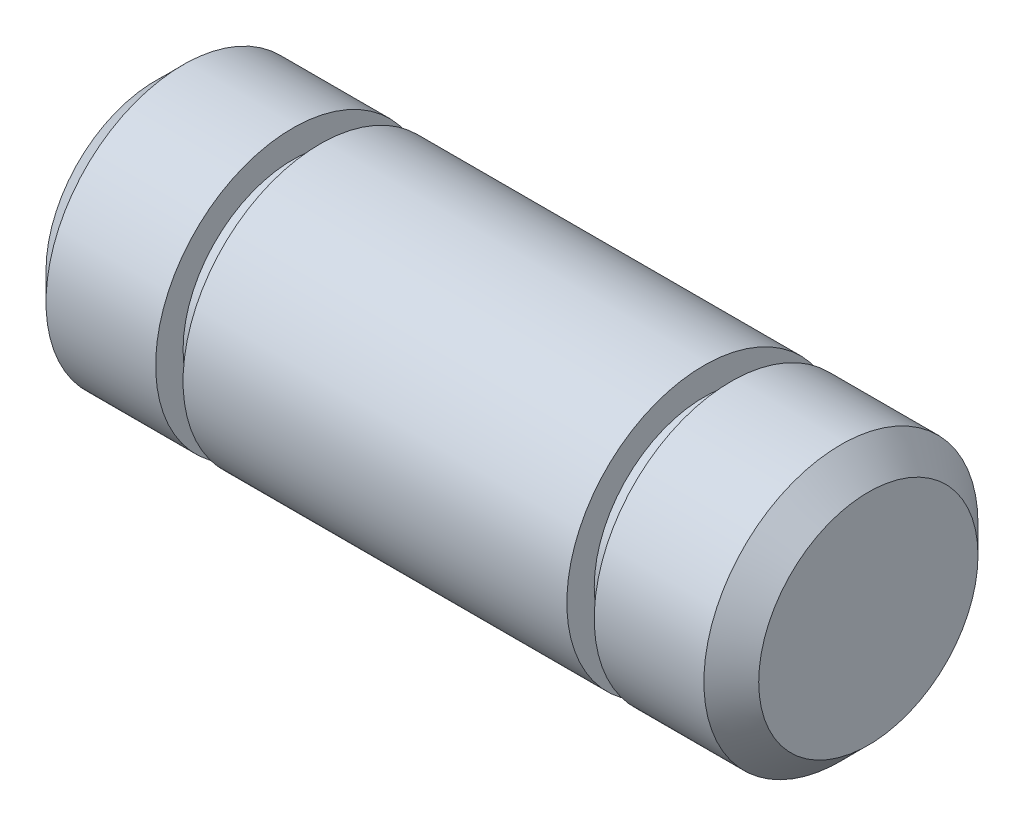
ISO-10303-21;
HEADER;
FILE_DESCRIPTION(('STEP AP214'),'2;1');
FILE_NAME('part.step','',(''),(''),'','','');
FILE_SCHEMA(('AUTOMOTIVE_DESIGN { 1 0 10303 214 1 1 1 1 }'));
ENDSEC;
DATA;
#1=APPLICATION_CONTEXT('core data for automotive mechanical design processes');
#2=APPLICATION_PROTOCOL_DEFINITION('international standard','automotive_design',2000,#1);
#3=PRODUCT_CONTEXT('',#1,'mechanical');
#4=PRODUCT('Part','Part','',(#3));
#5=PRODUCT_RELATED_PRODUCT_CATEGORY('part','',(#4));
#6=PRODUCT_DEFINITION_FORMATION('','',#4);
#7=PRODUCT_DEFINITION_CONTEXT('part definition',#1,'design');
#8=PRODUCT_DEFINITION('design','',#6,#7);
#9=PRODUCT_DEFINITION_SHAPE('','',#8);
#10=(LENGTH_UNIT() NAMED_UNIT(*) SI_UNIT(.MILLI.,.METRE.));
#11=(NAMED_UNIT(*) PLANE_ANGLE_UNIT() SI_UNIT($,.RADIAN.));
#12=(NAMED_UNIT(*) SI_UNIT($,.STERADIAN.) SOLID_ANGLE_UNIT());
#13=UNCERTAINTY_MEASURE_WITH_UNIT(LENGTH_MEASURE(1.E-05),#10,'distance_accuracy_value','');
#14=(GEOMETRIC_REPRESENTATION_CONTEXT(3) GLOBAL_UNCERTAINTY_ASSIGNED_CONTEXT((#13)) GLOBAL_UNIT_ASSIGNED_CONTEXT((#10,
#11,#12)) REPRESENTATION_CONTEXT('',''));
#15=CARTESIAN_POINT('',(0.,0.,0.));
#16=DIRECTION('',(0.,0.,1.));
#17=DIRECTION('',(1.,0.,0.));
#18=AXIS2_PLACEMENT_3D('',#15,#16,#17);
#19=CARTESIAN_POINT('',(0.,0.,0.));
#20=DIRECTION('',(-1.,0.,0.));
#21=DIRECTION('',(0.,0.,1.));
#22=AXIS2_PLACEMENT_3D('',#19,#20,#21);
#23=PLANE('',#22);
#24=CARTESIAN_POINT('',(0.,0.,0.));
#25=DIRECTION('',(1.,0.,0.));
#26=DIRECTION('',(0.,0.,-1.));
#27=AXIS2_PLACEMENT_3D('',#24,#25,#26);
#28=CIRCLE('',#27,4.);
#29=CARTESIAN_POINT('',(0.,0.,-4.));
#30=VERTEX_POINT('',#29);
#31=EDGE_CURVE('E10',#30,#30,#28,.T.);
#32=ORIENTED_EDGE('',*,*,#31,.F.);
#33=EDGE_LOOP('',(#32));
#34=FACE_BOUND('',#33,.T.);
#35=ADVANCED_FACE('F37',(#34),#23,.T.);
#36=CARTESIAN_POINT('',(1.,0.,0.));
#37=DIRECTION('',(1.,0.,0.));
#38=DIRECTION('',(0.,0.,-1.));
#39=AXIS2_PLACEMENT_3D('',#36,#37,#38);
#40=CONICAL_SURFACE('',#39,5.,0.785398163397448);
#41=ORIENTED_EDGE('',*,*,#31,.T.);
#42=EDGE_LOOP('',(#41));
#43=FACE_BOUND('',#42,.T.);
#44=CARTESIAN_POINT('',(1.,0.,0.));
#45=DIRECTION('',(1.,0.,0.));
#46=DIRECTION('',(0.,0.,-1.));
#47=AXIS2_PLACEMENT_3D('',#44,#45,#46);
#48=CIRCLE('',#47,5.);
#49=CARTESIAN_POINT('',(1.,0.,-5.));
#50=VERTEX_POINT('',#49);
#51=EDGE_CURVE('E44',#50,#50,#48,.T.);
#52=ORIENTED_EDGE('',*,*,#51,.F.);
#53=EDGE_LOOP('',(#52));
#54=FACE_BOUND('',#53,.T.);
#55=ADVANCED_FACE('F109',(#43,#54),#40,.T.);
#56=CARTESIAN_POINT('',(26.,0.,0.));
#57=DIRECTION('',(1.,0.,0.));
#58=DIRECTION('',(0.,0.,-1.));
#59=AXIS2_PLACEMENT_3D('',#56,#57,#58);
#60=CYLINDRICAL_SURFACE('',#59,5.);
#61=ORIENTED_EDGE('',*,*,#51,.T.);
#62=EDGE_LOOP('',(#61));
#63=FACE_BOUND('',#62,.T.);
#64=CARTESIAN_POINT('',(5.,0.,0.));
#65=DIRECTION('',(1.,0.,0.));
#66=DIRECTION('',(0.,0.,-1.));
#67=AXIS2_PLACEMENT_3D('',#64,#65,#66);
#68=CIRCLE('',#67,5.);
#69=CARTESIAN_POINT('',(5.,0.,-5.));
#70=VERTEX_POINT('',#69);
#71=EDGE_CURVE('E49',#70,#70,#68,.T.);
#72=ORIENTED_EDGE('',*,*,#71,.F.);
#73=EDGE_LOOP('',(#72));
#74=FACE_BOUND('',#73,.T.);
#75=ADVANCED_FACE('F114',(#63,#74),#60,.T.);
#76=CARTESIAN_POINT('',(5.,0.,-5.));
#77=DIRECTION('',(1.,0.,0.));
#78=DIRECTION('',(0.,0.,-1.));
#79=AXIS2_PLACEMENT_3D('',#76,#77,#78);
#80=PLANE('',#79);
#81=ORIENTED_EDGE('',*,*,#71,.T.);
#82=EDGE_LOOP('',(#81));
#83=FACE_BOUND('',#82,.T.);
#84=CARTESIAN_POINT('',(5.,0.,0.));
#85=DIRECTION('',(1.,0.,0.));
#86=DIRECTION('',(0.,0.,-1.));
#87=AXIS2_PLACEMENT_3D('',#84,#85,#86);
#88=CIRCLE('',#87,4.);
#89=CARTESIAN_POINT('',(5.,0.,-4.));
#90=VERTEX_POINT('',#89);
#91=EDGE_CURVE('E54',#90,#90,#88,.T.);
#92=ORIENTED_EDGE('',*,*,#91,.F.);
#93=EDGE_LOOP('',(#92));
#94=FACE_BOUND('',#93,.T.);
#95=ADVANCED_FACE('F118',(#83,#94),#80,.T.);
#96=CARTESIAN_POINT('',(26.,0.,0.));
#97=DIRECTION('',(1.,0.,0.));
#98=DIRECTION('',(0.,0.,-1.));
#99=AXIS2_PLACEMENT_3D('',#96,#97,#98);
#100=CYLINDRICAL_SURFACE('',#99,4.);
#101=ORIENTED_EDGE('',*,*,#91,.T.);
#102=EDGE_LOOP('',(#101));
#103=FACE_BOUND('',#102,.T.);
#104=CARTESIAN_POINT('',(6.,0.,0.));
#105=DIRECTION('',(1.,0.,0.));
#106=DIRECTION('',(0.,0.,-1.));
#107=AXIS2_PLACEMENT_3D('',#104,#105,#106);
#108=CIRCLE('',#107,4.);
#109=CARTESIAN_POINT('',(6.,0.,-4.));
#110=VERTEX_POINT('',#109);
#111=EDGE_CURVE('E60',#110,#110,#108,.T.);
#112=ORIENTED_EDGE('',*,*,#111,.F.);
#113=EDGE_LOOP('',(#112));
#114=FACE_BOUND('',#113,.T.);
#115=ADVANCED_FACE('F124',(#103,#114),#100,.T.);
#116=CARTESIAN_POINT('',(6.,0.,-4.));
#117=DIRECTION('',(-1.,0.,0.));
#118=DIRECTION('',(0.,0.,1.));
#119=AXIS2_PLACEMENT_3D('',#116,#117,#118);
#120=PLANE('',#119);
#121=ORIENTED_EDGE('',*,*,#111,.T.);
#122=EDGE_LOOP('',(#121));
#123=FACE_BOUND('',#122,.T.);
#124=CARTESIAN_POINT('',(6.,0.,0.));
#125=DIRECTION('',(1.,0.,0.));
#126=DIRECTION('',(0.,0.,-1.));
#127=AXIS2_PLACEMENT_3D('',#124,#125,#126);
#128=CIRCLE('',#127,5.);
#129=CARTESIAN_POINT('',(6.,0.,-5.));
#130=VERTEX_POINT('',#129);
#131=EDGE_CURVE('E64',#130,#130,#128,.T.);
#132=ORIENTED_EDGE('',*,*,#131,.F.);
#133=EDGE_LOOP('',(#132));
#134=FACE_BOUND('',#133,.T.);
#135=ADVANCED_FACE('F128',(#123,#134),#120,.T.);
#136=CARTESIAN_POINT('',(26.,0.,0.));
#137=DIRECTION('',(1.,0.,0.));
#138=DIRECTION('',(0.,0.,-1.));
#139=AXIS2_PLACEMENT_3D('',#136,#137,#138);
#140=CYLINDRICAL_SURFACE('',#139,5.);
#141=ORIENTED_EDGE('',*,*,#131,.T.);
#142=EDGE_LOOP('',(#141));
#143=FACE_BOUND('',#142,.T.);
#144=CARTESIAN_POINT('',(20.,0.,0.));
#145=DIRECTION('',(1.,0.,0.));
#146=DIRECTION('',(0.,0.,-1.));
#147=AXIS2_PLACEMENT_3D('',#144,#145,#146);
#148=CIRCLE('',#147,5.);
#149=CARTESIAN_POINT('',(20.,0.,-5.));
#150=VERTEX_POINT('',#149);
#151=EDGE_CURVE('E68',#150,#150,#148,.T.);
#152=ORIENTED_EDGE('',*,*,#151,.F.);
#153=EDGE_LOOP('',(#152));
#154=FACE_BOUND('',#153,.T.);
#155=ADVANCED_FACE('F132',(#143,#154),#140,.T.);
#156=CARTESIAN_POINT('',(20.,0.,-5.));
#157=DIRECTION('',(1.,0.,0.));
#158=DIRECTION('',(0.,0.,-1.));
#159=AXIS2_PLACEMENT_3D('',#156,#157,#158);
#160=PLANE('',#159);
#161=ORIENTED_EDGE('',*,*,#151,.T.);
#162=EDGE_LOOP('',(#161));
#163=FACE_BOUND('',#162,.T.);
#164=CARTESIAN_POINT('',(20.,0.,0.));
#165=DIRECTION('',(1.,0.,0.));
#166=DIRECTION('',(0.,0.,-1.));
#167=AXIS2_PLACEMENT_3D('',#164,#165,#166);
#168=CIRCLE('',#167,4.);
#169=CARTESIAN_POINT('',(20.,0.,-4.));
#170=VERTEX_POINT('',#169);
#171=EDGE_CURVE('E72',#170,#170,#168,.T.);
#172=ORIENTED_EDGE('',*,*,#171,.F.);
#173=EDGE_LOOP('',(#172));
#174=FACE_BOUND('',#173,.T.);
#175=ADVANCED_FACE('F136',(#163,#174),#160,.T.);
#176=CARTESIAN_POINT('',(26.,0.,0.));
#177=DIRECTION('',(1.,0.,0.));
#178=DIRECTION('',(0.,0.,-1.));
#179=AXIS2_PLACEMENT_3D('',#176,#177,#178);
#180=CYLINDRICAL_SURFACE('',#179,4.);
#181=ORIENTED_EDGE('',*,*,#171,.T.);
#182=EDGE_LOOP('',(#181));
#183=FACE_BOUND('',#182,.T.);
#184=CARTESIAN_POINT('',(21.,0.,0.));
#185=DIRECTION('',(1.,0.,0.));
#186=DIRECTION('',(0.,0.,-1.));
#187=AXIS2_PLACEMENT_3D('',#184,#185,#186);
#188=CIRCLE('',#187,4.);
#189=CARTESIAN_POINT('',(21.,0.,-4.));
#190=VERTEX_POINT('',#189);
#191=EDGE_CURVE('E76',#190,#190,#188,.T.);
#192=ORIENTED_EDGE('',*,*,#191,.F.);
#193=EDGE_LOOP('',(#192));
#194=FACE_BOUND('',#193,.T.);
#195=ADVANCED_FACE('F140',(#183,#194),#180,.T.);
#196=CARTESIAN_POINT('',(21.,0.,-4.));
#197=DIRECTION('',(-1.,0.,0.));
#198=DIRECTION('',(0.,0.,1.));
#199=AXIS2_PLACEMENT_3D('',#196,#197,#198);
#200=PLANE('',#199);
#201=ORIENTED_EDGE('',*,*,#191,.T.);
#202=EDGE_LOOP('',(#201));
#203=FACE_BOUND('',#202,.T.);
#204=CARTESIAN_POINT('',(21.,0.,0.));
#205=DIRECTION('',(1.,0.,0.));
#206=DIRECTION('',(0.,0.,-1.));
#207=AXIS2_PLACEMENT_3D('',#204,#205,#206);
#208=CIRCLE('',#207,5.);
#209=CARTESIAN_POINT('',(21.,0.,-5.));
#210=VERTEX_POINT('',#209);
#211=EDGE_CURVE('E80',#210,#210,#208,.T.);
#212=ORIENTED_EDGE('',*,*,#211,.F.);
#213=EDGE_LOOP('',(#212));
#214=FACE_BOUND('',#213,.T.);
#215=ADVANCED_FACE('F105',(#203,#214),#200,.T.);
#216=CARTESIAN_POINT('',(26.,0.,0.));
#217=DIRECTION('',(1.,0.,0.));
#218=DIRECTION('',(0.,0.,-1.));
#219=AXIS2_PLACEMENT_3D('',#216,#217,#218);
#220=CYLINDRICAL_SURFACE('',#219,5.);
#221=ORIENTED_EDGE('',*,*,#211,.T.);
#222=EDGE_LOOP('',(#221));
#223=FACE_BOUND('',#222,.T.);
#224=CARTESIAN_POINT('',(25.,0.,0.));
#225=DIRECTION('',(1.,0.,0.));
#226=DIRECTION('',(0.,0.,-1.));
#227=AXIS2_PLACEMENT_3D('',#224,#225,#226);
#228=CIRCLE('',#227,5.);
#229=CARTESIAN_POINT('',(25.,0.,-5.));
#230=VERTEX_POINT('',#229);
#231=EDGE_CURVE('E84',#230,#230,#228,.T.);
#232=ORIENTED_EDGE('',*,*,#231,.F.);
#233=EDGE_LOOP('',(#232));
#234=FACE_BOUND('',#233,.T.);
#235=ADVANCED_FACE('F97',(#223,#234),#220,.T.);
#236=CARTESIAN_POINT('',(26.,0.,0.));
#237=DIRECTION('',(-1.,0.,0.));
#238=DIRECTION('',(0.,0.,1.));
#239=AXIS2_PLACEMENT_3D('',#236,#237,#238);
#240=CONICAL_SURFACE('',#239,4.,0.785398163397448);
#241=ORIENTED_EDGE('',*,*,#231,.T.);
#242=EDGE_LOOP('',(#241));
#243=FACE_BOUND('',#242,.T.);
#244=CARTESIAN_POINT('',(26.,0.,0.));
#245=DIRECTION('',(1.,0.,0.));
#246=DIRECTION('',(0.,0.,-1.));
#247=AXIS2_PLACEMENT_3D('',#244,#245,#246);
#248=CIRCLE('',#247,4.);
#249=CARTESIAN_POINT('',(26.,0.,-4.));
#250=VERTEX_POINT('',#249);
#251=EDGE_CURVE('E88',#250,#250,#248,.T.);
#252=ORIENTED_EDGE('',*,*,#251,.F.);
#253=EDGE_LOOP('',(#252));
#254=FACE_BOUND('',#253,.T.);
#255=ADVANCED_FACE('F95',(#243,#254),#240,.T.);
#256=CARTESIAN_POINT('',(26.,0.,-4.));
#257=DIRECTION('',(1.,0.,0.));
#258=DIRECTION('',(0.,0.,-1.));
#259=AXIS2_PLACEMENT_3D('',#256,#257,#258);
#260=PLANE('',#259);
#261=ORIENTED_EDGE('',*,*,#251,.T.);
#262=EDGE_LOOP('',(#261));
#263=FACE_BOUND('',#262,.T.);
#264=ADVANCED_FACE('F93',(#263),#260,.T.);
#265=CLOSED_SHELL('',(#35,#55,#75,#95,#115,#135,#155,#175,#195,#215,#235,#255,#264));
#266=MANIFOLD_SOLID_BREP('B2',#265);
#267=ADVANCED_BREP_SHAPE_REPRESENTATION('',(#18,#266),#14);
#268=SHAPE_DEFINITION_REPRESENTATION(#9,#267);
ENDSEC;
END-ISO-10303-21;
